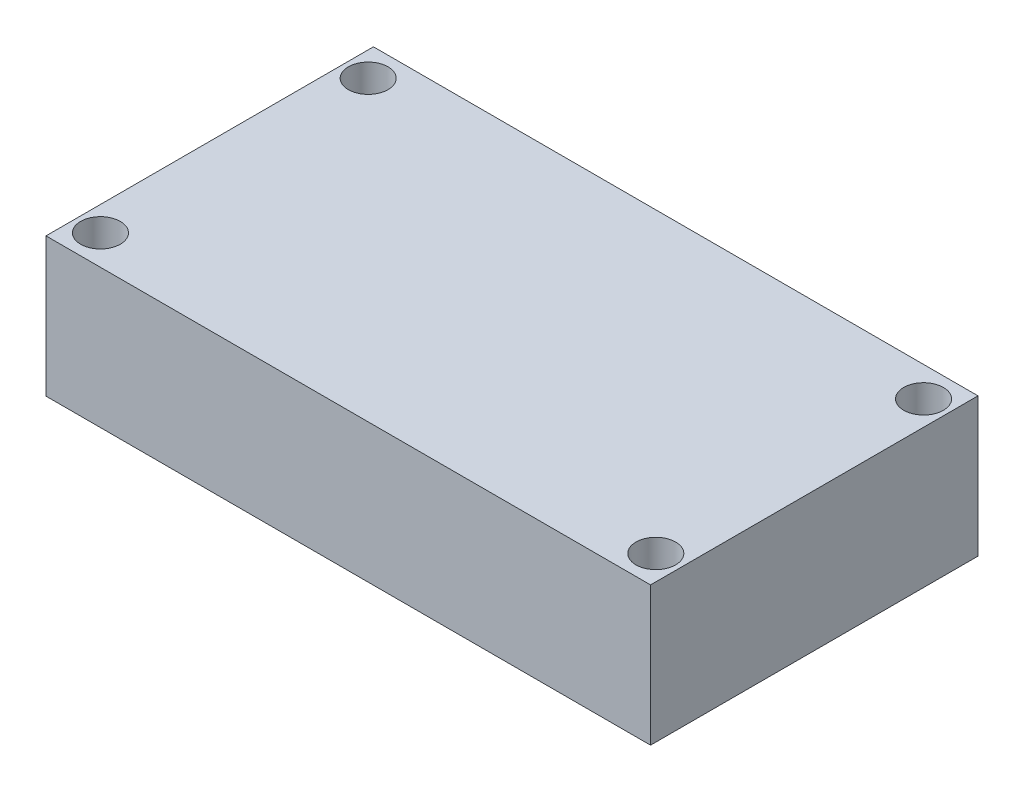
ISO-10303-21;
HEADER;
FILE_DESCRIPTION(('STEP AP214'),'2;1');
FILE_NAME('part.step','',(''),(''),'','','');
FILE_SCHEMA(('AUTOMOTIVE_DESIGN { 1 0 10303 214 1 1 1 1 }'));
ENDSEC;
DATA;
#1=APPLICATION_CONTEXT('core data for automotive mechanical design processes');
#2=APPLICATION_PROTOCOL_DEFINITION('international standard','automotive_design',2000,#1);
#3=PRODUCT_CONTEXT('',#1,'mechanical');
#4=PRODUCT('Part','Part','',(#3));
#5=PRODUCT_RELATED_PRODUCT_CATEGORY('part','',(#4));
#6=PRODUCT_DEFINITION_FORMATION('','',#4);
#7=PRODUCT_DEFINITION_CONTEXT('part definition',#1,'design');
#8=PRODUCT_DEFINITION('design','',#6,#7);
#9=PRODUCT_DEFINITION_SHAPE('','',#8);
#10=(LENGTH_UNIT() NAMED_UNIT(*) SI_UNIT(.MILLI.,.METRE.));
#11=(NAMED_UNIT(*) PLANE_ANGLE_UNIT() SI_UNIT($,.RADIAN.));
#12=(NAMED_UNIT(*) SI_UNIT($,.STERADIAN.) SOLID_ANGLE_UNIT());
#13=UNCERTAINTY_MEASURE_WITH_UNIT(LENGTH_MEASURE(1.E-05),#10,'distance_accuracy_value','');
#14=(GEOMETRIC_REPRESENTATION_CONTEXT(3) GLOBAL_UNCERTAINTY_ASSIGNED_CONTEXT((#13)) GLOBAL_UNIT_ASSIGNED_CONTEXT((#10,
#11,#12)) REPRESENTATION_CONTEXT('',''));
#15=CARTESIAN_POINT('',(0.,0.,0.));
#16=DIRECTION('',(0.,0.,1.));
#17=DIRECTION('',(1.,0.,0.));
#18=AXIS2_PLACEMENT_3D('',#15,#16,#17);
#19=CARTESIAN_POINT('',(30.48,14.,16.51));
#20=DIRECTION('',(-1.,0.,0.));
#21=DIRECTION('',(0.,0.,1.));
#22=AXIS2_PLACEMENT_3D('',#19,#20,#21);
#23=PLANE('',#22);
#24=DIRECTION('',(0.,0.,-1.));
#25=VECTOR('',#24,1.);
#26=CARTESIAN_POINT('',(30.48,0.,16.51));
#27=LINE('',#26,#25);
#28=CARTESIAN_POINT('',(30.48,0.,16.51));
#29=VERTEX_POINT('',#28);
#30=CARTESIAN_POINT('',(30.48,0.,-16.51));
#31=VERTEX_POINT('',#30);
#32=EDGE_CURVE('E96',#29,#31,#27,.T.);
#33=ORIENTED_EDGE('',*,*,#32,.T.);
#34=DIRECTION('',(0.,-1.,0.));
#35=VECTOR('',#34,1.);
#36=CARTESIAN_POINT('',(30.48,14.,-16.51));
#37=LINE('',#36,#35);
#38=CARTESIAN_POINT('',(30.48,14.,-16.51));
#39=VERTEX_POINT('',#38);
#40=EDGE_CURVE('E11',#39,#31,#37,.T.);
#41=ORIENTED_EDGE('',*,*,#40,.F.);
#42=DIRECTION('',(0.,0.,-1.));
#43=VECTOR('',#42,1.);
#44=CARTESIAN_POINT('',(30.48,14.,16.51));
#45=LINE('',#44,#43);
#46=CARTESIAN_POINT('',(30.48,14.,16.51));
#47=VERTEX_POINT('',#46);
#48=EDGE_CURVE('E84',#47,#39,#45,.T.);
#49=ORIENTED_EDGE('',*,*,#48,.F.);
#50=DIRECTION('',(0.,-1.,0.));
#51=VECTOR('',#50,1.);
#52=CARTESIAN_POINT('',(30.48,14.,16.51));
#53=LINE('',#52,#51);
#54=EDGE_CURVE('E92',#47,#29,#53,.T.);
#55=ORIENTED_EDGE('',*,*,#54,.T.);
#56=EDGE_LOOP('',(#33,#41,#49,#55));
#57=FACE_BOUND('',#56,.T.);
#58=ADVANCED_FACE('F33',(#57),#23,.F.);
#59=CARTESIAN_POINT('',(-30.48,14.,-16.51));
#60=DIRECTION('',(0.,0.,1.));
#61=DIRECTION('',(1.,0.,0.));
#62=AXIS2_PLACEMENT_3D('',#59,#60,#61);
#63=PLANE('',#62);
#64=DIRECTION('',(-1.,0.,0.));
#65=VECTOR('',#64,1.);
#66=CARTESIAN_POINT('',(-30.48,0.,-16.51));
#67=LINE('',#66,#65);
#68=CARTESIAN_POINT('',(-30.48,0.,-16.51));
#69=VERTEX_POINT('',#68);
#70=EDGE_CURVE('E88',#31,#69,#67,.T.);
#71=ORIENTED_EDGE('',*,*,#70,.T.);
#72=DIRECTION('',(0.,-1.,0.));
#73=VECTOR('',#72,1.);
#74=CARTESIAN_POINT('',(-30.48,14.,-16.51));
#75=LINE('',#74,#73);
#76=CARTESIAN_POINT('',(-30.48,14.,-16.51));
#77=VERTEX_POINT('',#76);
#78=EDGE_CURVE('E41',#77,#69,#75,.T.);
#79=ORIENTED_EDGE('',*,*,#78,.F.);
#80=DIRECTION('',(-1.,0.,0.));
#81=VECTOR('',#80,1.);
#82=CARTESIAN_POINT('',(-30.48,14.,-16.51));
#83=LINE('',#82,#81);
#84=EDGE_CURVE('E79',#39,#77,#83,.T.);
#85=ORIENTED_EDGE('',*,*,#84,.F.);
#86=ORIENTED_EDGE('',*,*,#40,.T.);
#87=EDGE_LOOP('',(#71,#79,#85,#86));
#88=FACE_BOUND('',#87,.T.);
#89=ADVANCED_FACE('F87',(#88),#63,.F.);
#90=CARTESIAN_POINT('',(-30.48,14.,16.51));
#91=DIRECTION('',(1.,0.,0.));
#92=DIRECTION('',(0.,0.,-1.));
#93=AXIS2_PLACEMENT_3D('',#90,#91,#92);
#94=PLANE('',#93);
#95=DIRECTION('',(0.,0.,1.));
#96=VECTOR('',#95,1.);
#97=CARTESIAN_POINT('',(-30.48,0.,16.51));
#98=LINE('',#97,#96);
#99=CARTESIAN_POINT('',(-30.48,0.,16.51));
#100=VERTEX_POINT('',#99);
#101=EDGE_CURVE('E66',#69,#100,#98,.T.);
#102=ORIENTED_EDGE('',*,*,#101,.T.);
#103=DIRECTION('',(0.,-1.,0.));
#104=VECTOR('',#103,1.);
#105=CARTESIAN_POINT('',(-30.48,14.,16.51));
#106=LINE('',#105,#104);
#107=CARTESIAN_POINT('',(-30.48,14.,16.51));
#108=VERTEX_POINT('',#107);
#109=EDGE_CURVE('E89',#108,#100,#106,.T.);
#110=ORIENTED_EDGE('',*,*,#109,.F.);
#111=DIRECTION('',(0.,0.,1.));
#112=VECTOR('',#111,1.);
#113=CARTESIAN_POINT('',(-30.48,14.,16.51));
#114=LINE('',#113,#112);
#115=EDGE_CURVE('E82',#77,#108,#114,.T.);
#116=ORIENTED_EDGE('',*,*,#115,.F.);
#117=ORIENTED_EDGE('',*,*,#78,.T.);
#118=EDGE_LOOP('',(#102,#110,#116,#117));
#119=FACE_BOUND('',#118,.T.);
#120=ADVANCED_FACE('F90',(#119),#94,.F.);
#121=CARTESIAN_POINT('',(-30.48,14.,16.51));
#122=DIRECTION('',(0.,0.,-1.));
#123=DIRECTION('',(-1.,0.,0.));
#124=AXIS2_PLACEMENT_3D('',#121,#122,#123);
#125=PLANE('',#124);
#126=DIRECTION('',(1.,0.,0.));
#127=VECTOR('',#126,1.);
#128=CARTESIAN_POINT('',(-30.48,0.,16.51));
#129=LINE('',#128,#127);
#130=EDGE_CURVE('E72',#100,#29,#129,.T.);
#131=ORIENTED_EDGE('',*,*,#130,.T.);
#132=ORIENTED_EDGE('',*,*,#54,.F.);
#133=DIRECTION('',(1.,0.,0.));
#134=VECTOR('',#133,1.);
#135=CARTESIAN_POINT('',(-30.48,14.,16.51));
#136=LINE('',#135,#134);
#137=EDGE_CURVE('E49',#108,#47,#136,.T.);
#138=ORIENTED_EDGE('',*,*,#137,.F.);
#139=ORIENTED_EDGE('',*,*,#109,.T.);
#140=EDGE_LOOP('',(#131,#132,#138,#139));
#141=FACE_BOUND('',#140,.T.);
#142=ADVANCED_FACE('F104',(#141),#125,.F.);
#143=CARTESIAN_POINT('',(0.,14.,0.));
#144=DIRECTION('',(0.,-1.,0.));
#145=DIRECTION('',(0.,0.,-1.));
#146=AXIS2_PLACEMENT_3D('',#143,#144,#145);
#147=PLANE('',#146);
#148=CARTESIAN_POINT('',(-28.,14.,13.5));
#149=DIRECTION('',(0.,1.,0.));
#150=DIRECTION('',(0.,0.,-1.));
#151=AXIS2_PLACEMENT_3D('',#148,#149,#150);
#152=CIRCLE('',#151,2.);
#153=CARTESIAN_POINT('',(-28.,14.,15.5));
#154=VERTEX_POINT('',#153);
#155=EDGE_CURVE('E119',#154,#154,#152,.T.);
#156=ORIENTED_EDGE('',*,*,#155,.F.);
#157=EDGE_LOOP('',(#156));
#158=FACE_BOUND('',#157,.T.);
#159=CARTESIAN_POINT('',(28.,14.,13.5));
#160=DIRECTION('',(0.,1.,0.));
#161=DIRECTION('',(0.,0.,-1.));
#162=AXIS2_PLACEMENT_3D('',#159,#160,#161);
#163=CIRCLE('',#162,2.);
#164=CARTESIAN_POINT('',(28.,14.,15.5));
#165=VERTEX_POINT('',#164);
#166=EDGE_CURVE('E125',#165,#165,#163,.T.);
#167=ORIENTED_EDGE('',*,*,#166,.F.);
#168=EDGE_LOOP('',(#167));
#169=FACE_BOUND('',#168,.T.);
#170=CARTESIAN_POINT('',(28.,14.,-13.5));
#171=DIRECTION('',(0.,1.,0.));
#172=DIRECTION('',(0.,0.,1.));
#173=AXIS2_PLACEMENT_3D('',#170,#171,#172);
#174=CIRCLE('',#173,2.);
#175=CARTESIAN_POINT('',(28.,14.,-11.5));
#176=VERTEX_POINT('',#175);
#177=EDGE_CURVE('E113',#176,#176,#174,.T.);
#178=ORIENTED_EDGE('',*,*,#177,.F.);
#179=EDGE_LOOP('',(#178));
#180=FACE_BOUND('',#179,.T.);
#181=CARTESIAN_POINT('',(-28.,14.,-13.5));
#182=DIRECTION('',(0.,1.,0.));
#183=DIRECTION('',(0.,0.,1.));
#184=AXIS2_PLACEMENT_3D('',#181,#182,#183);
#185=CIRCLE('',#184,2.);
#186=CARTESIAN_POINT('',(-28.,14.,-11.5));
#187=VERTEX_POINT('',#186);
#188=EDGE_CURVE('E99',#187,#187,#185,.T.);
#189=ORIENTED_EDGE('',*,*,#188,.F.);
#190=EDGE_LOOP('',(#189));
#191=FACE_BOUND('',#190,.T.);
#192=ORIENTED_EDGE('',*,*,#48,.T.);
#193=ORIENTED_EDGE('',*,*,#84,.T.);
#194=ORIENTED_EDGE('',*,*,#115,.T.);
#195=ORIENTED_EDGE('',*,*,#137,.T.);
#196=EDGE_LOOP('',(#192,#193,#194,#195));
#197=FACE_BOUND('',#196,.T.);
#198=ADVANCED_FACE('F80',(#158,#169,#180,#191,#197),#147,.F.);
#199=CARTESIAN_POINT('',(0.,0.,0.));
#200=DIRECTION('',(0.,-1.,0.));
#201=DIRECTION('',(0.,0.,-1.));
#202=AXIS2_PLACEMENT_3D('',#199,#200,#201);
#203=PLANE('',#202);
#204=CARTESIAN_POINT('',(-28.,0.,13.5));
#205=DIRECTION('',(0.,-1.,0.));
#206=DIRECTION('',(0.,0.,-1.));
#207=AXIS2_PLACEMENT_3D('',#204,#205,#206);
#208=CIRCLE('',#207,2.);
#209=CARTESIAN_POINT('',(-28.,0.,15.5));
#210=VERTEX_POINT('',#209);
#211=EDGE_CURVE('E116',#210,#210,#208,.F.);
#212=ORIENTED_EDGE('',*,*,#211,.T.);
#213=EDGE_LOOP('',(#212));
#214=FACE_BOUND('',#213,.T.);
#215=CARTESIAN_POINT('',(28.,0.,13.5));
#216=DIRECTION('',(0.,-1.,0.));
#217=DIRECTION('',(0.,0.,-1.));
#218=AXIS2_PLACEMENT_3D('',#215,#216,#217);
#219=CIRCLE('',#218,2.);
#220=CARTESIAN_POINT('',(28.,0.,15.5));
#221=VERTEX_POINT('',#220);
#222=EDGE_CURVE('E122',#221,#221,#219,.F.);
#223=ORIENTED_EDGE('',*,*,#222,.T.);
#224=EDGE_LOOP('',(#223));
#225=FACE_BOUND('',#224,.T.);
#226=CARTESIAN_POINT('',(28.,0.,-13.5));
#227=DIRECTION('',(0.,-1.,0.));
#228=DIRECTION('',(0.,0.,-1.));
#229=AXIS2_PLACEMENT_3D('',#226,#227,#228);
#230=CIRCLE('',#229,2.);
#231=CARTESIAN_POINT('',(28.,0.,-11.5));
#232=VERTEX_POINT('',#231);
#233=EDGE_CURVE('E128',#232,#232,#230,.F.);
#234=ORIENTED_EDGE('',*,*,#233,.T.);
#235=EDGE_LOOP('',(#234));
#236=FACE_BOUND('',#235,.T.);
#237=CARTESIAN_POINT('',(-28.,0.,-13.5));
#238=DIRECTION('',(0.,-1.,0.));
#239=DIRECTION('',(0.,0.,-1.));
#240=AXIS2_PLACEMENT_3D('',#237,#238,#239);
#241=CIRCLE('',#240,2.);
#242=CARTESIAN_POINT('',(-28.,0.,-11.5));
#243=VERTEX_POINT('',#242);
#244=EDGE_CURVE('E110',#243,#243,#241,.F.);
#245=ORIENTED_EDGE('',*,*,#244,.T.);
#246=EDGE_LOOP('',(#245));
#247=FACE_BOUND('',#246,.T.);
#248=ORIENTED_EDGE('',*,*,#32,.F.);
#249=ORIENTED_EDGE('',*,*,#130,.F.);
#250=ORIENTED_EDGE('',*,*,#101,.F.);
#251=ORIENTED_EDGE('',*,*,#70,.F.);
#252=EDGE_LOOP('',(#248,#249,#250,#251));
#253=FACE_BOUND('',#252,.T.);
#254=ADVANCED_FACE('F107',(#214,#225,#236,#247,#253),#203,.T.);
#255=CARTESIAN_POINT('',(-28.,-0.000999999999999265,-13.5));
#256=DIRECTION('',(0.,1.,0.));
#257=DIRECTION('',(0.,0.,1.));
#258=AXIS2_PLACEMENT_3D('',#255,#256,#257);
#259=CYLINDRICAL_SURFACE('',#258,2.);
#260=CARTESIAN_POINT('',(-28.,0.,-11.5));
#261=CARTESIAN_POINT('',(-28.,0.145833333333333,-11.5));
#262=CARTESIAN_POINT('',(-28.,0.291666666666667,-11.5));
#263=CARTESIAN_POINT('',(-28.,0.583333333333333,-11.5));
#264=CARTESIAN_POINT('',(-28.,0.729166666666667,-11.5));
#265=CARTESIAN_POINT('',(-28.,1.02083333333333,-11.5));
#266=CARTESIAN_POINT('',(-28.,1.16666666666667,-11.5));
#267=CARTESIAN_POINT('',(-28.,1.45833333333333,-11.5));
#268=CARTESIAN_POINT('',(-28.,1.60416666666667,-11.5));
#269=CARTESIAN_POINT('',(-28.,1.89583333333333,-11.5));
#270=CARTESIAN_POINT('',(-28.,2.04166666666667,-11.5));
#271=CARTESIAN_POINT('',(-28.,2.33333333333333,-11.5));
#272=CARTESIAN_POINT('',(-28.,2.47916666666667,-11.5));
#273=CARTESIAN_POINT('',(-28.,2.77083333333333,-11.5));
#274=CARTESIAN_POINT('',(-28.,2.91666666666667,-11.5));
#275=CARTESIAN_POINT('',(-28.,3.20833333333333,-11.5));
#276=CARTESIAN_POINT('',(-28.,3.35416666666667,-11.5));
#277=CARTESIAN_POINT('',(-28.,3.64583333333333,-11.5));
#278=CARTESIAN_POINT('',(-28.,3.79166666666667,-11.5));
#279=CARTESIAN_POINT('',(-28.,4.08333333333333,-11.5));
#280=CARTESIAN_POINT('',(-28.,4.22916666666667,-11.5));
#281=CARTESIAN_POINT('',(-28.,4.52083333333333,-11.5));
#282=CARTESIAN_POINT('',(-28.,4.66666666666667,-11.5));
#283=CARTESIAN_POINT('',(-28.,4.95833333333333,-11.5));
#284=CARTESIAN_POINT('',(-28.,5.10416666666667,-11.5));
#285=CARTESIAN_POINT('',(-28.,5.39583333333333,-11.5));
#286=CARTESIAN_POINT('',(-28.,5.54166666666667,-11.5));
#287=CARTESIAN_POINT('',(-28.,5.83333333333333,-11.5));
#288=CARTESIAN_POINT('',(-28.,5.97916666666667,-11.5));
#289=CARTESIAN_POINT('',(-28.,6.27083333333333,-11.5));
#290=CARTESIAN_POINT('',(-28.,6.41666666666667,-11.5));
#291=CARTESIAN_POINT('',(-28.,6.70833333333333,-11.5));
#292=CARTESIAN_POINT('',(-28.,6.85416666666667,-11.5));
#293=CARTESIAN_POINT('',(-28.,7.14583333333333,-11.5));
#294=CARTESIAN_POINT('',(-28.,7.29166666666667,-11.5));
#295=CARTESIAN_POINT('',(-28.,7.58333333333333,-11.5));
#296=CARTESIAN_POINT('',(-28.,7.72916666666667,-11.5));
#297=CARTESIAN_POINT('',(-28.,8.02083333333333,-11.5));
#298=CARTESIAN_POINT('',(-28.,8.16666666666667,-11.5));
#299=CARTESIAN_POINT('',(-28.,8.45833333333333,-11.5));
#300=CARTESIAN_POINT('',(-28.,8.60416666666667,-11.5));
#301=CARTESIAN_POINT('',(-28.,8.89583333333333,-11.5));
#302=CARTESIAN_POINT('',(-28.,9.04166666666666,-11.5));
#303=CARTESIAN_POINT('',(-28.,9.33333333333333,-11.5));
#304=CARTESIAN_POINT('',(-28.,9.47916666666667,-11.5));
#305=CARTESIAN_POINT('',(-28.,9.77083333333333,-11.5));
#306=CARTESIAN_POINT('',(-28.,9.91666666666667,-11.5));
#307=CARTESIAN_POINT('',(-28.,10.2083333333333,-11.5));
#308=CARTESIAN_POINT('',(-28.,10.3541666666667,-11.5));
#309=CARTESIAN_POINT('',(-28.,10.6458333333333,-11.5));
#310=CARTESIAN_POINT('',(-28.,10.7916666666667,-11.5));
#311=CARTESIAN_POINT('',(-28.,11.0833333333333,-11.5));
#312=CARTESIAN_POINT('',(-28.,11.2291666666667,-11.5));
#313=CARTESIAN_POINT('',(-28.,11.5208333333333,-11.5));
#314=CARTESIAN_POINT('',(-28.,11.6666666666667,-11.5));
#315=CARTESIAN_POINT('',(-28.,11.9583333333333,-11.5));
#316=CARTESIAN_POINT('',(-28.,12.1041666666667,-11.5));
#317=CARTESIAN_POINT('',(-28.,12.3958333333333,-11.5));
#318=CARTESIAN_POINT('',(-28.,12.5416666666667,-11.5));
#319=CARTESIAN_POINT('',(-28.,12.8333333333333,-11.5));
#320=CARTESIAN_POINT('',(-28.,12.9791666666667,-11.5));
#321=CARTESIAN_POINT('',(-28.,13.2708333333333,-11.5));
#322=CARTESIAN_POINT('',(-28.,13.4166666666667,-11.5));
#323=CARTESIAN_POINT('',(-28.,13.7083333333333,-11.5));
#324=CARTESIAN_POINT('',(-28.,13.8541666666667,-11.5));
#325=CARTESIAN_POINT('',(-28.,14.,-11.5));
#326=B_SPLINE_CURVE_WITH_KNOTS('',3,(#260,#261,#262,#263,#264,#265,#266,#267,#268,#269,#270,
#271,#272,#273,#274,#275,#276,#277,#278,#279,#280,#281,#282,#283,#284,#285,#286,#287,#288,#289,
#290,#291,#292,#293,#294,#295,#296,#297,#298,#299,#300,#301,#302,#303,#304,#305,#306,#307,#308,
#309,#310,#311,#312,#313,#314,#315,#316,#317,#318,#319,#320,#321,#322,#323,#324,#325),
.UNSPECIFIED.,.F.,.F.,(4,2,2,2,2,2,2,2,2,2,2,2,2,2,2,2,2,2,2,2,2,2,2,2,2,2,2,2,2,2,2,2,4),(0.,
0.4375,0.875,1.3125,1.75,2.1875,2.625,3.0625,3.5,3.9375,4.375,4.8125,5.25,5.6875,6.125,6.5625,
7.,7.4375,7.875,8.3125,8.75,9.1875,9.625,10.0625,10.5,10.9375,11.375,11.8125,12.25,12.6875,
13.125,13.5625,14.),.UNSPECIFIED.);
#327=EDGE_CURVE('BSEAM142',#243,#187,#326,.T.);
#328=ORIENTED_EDGE('',*,*,#244,.F.);
#329=ORIENTED_EDGE('',*,*,#188,.T.);
#330=ORIENTED_EDGE('',*,*,#327,.T.);
#331=ORIENTED_EDGE('',*,*,#327,.F.);
#332=EDGE_LOOP('',(#328,#330,#329,#331));
#333=FACE_BOUND('',#332,.T.);
#334=ADVANCED_FACE('F142',(#333),#259,.F.);
#335=CARTESIAN_POINT('',(28.,-0.000999999999999265,-13.5));
#336=DIRECTION('',(0.,1.,0.));
#337=DIRECTION('',(0.,0.,1.));
#338=AXIS2_PLACEMENT_3D('',#335,#336,#337);
#339=CYLINDRICAL_SURFACE('',#338,2.);
#340=CARTESIAN_POINT('',(28.,0.,-11.5));
#341=CARTESIAN_POINT('',(28.,0.145833333333333,-11.5));
#342=CARTESIAN_POINT('',(28.,0.291666666666667,-11.5));
#343=CARTESIAN_POINT('',(28.,0.583333333333333,-11.5));
#344=CARTESIAN_POINT('',(28.,0.729166666666667,-11.5));
#345=CARTESIAN_POINT('',(28.,1.02083333333333,-11.5));
#346=CARTESIAN_POINT('',(28.,1.16666666666667,-11.5));
#347=CARTESIAN_POINT('',(28.,1.45833333333333,-11.5));
#348=CARTESIAN_POINT('',(28.,1.60416666666667,-11.5));
#349=CARTESIAN_POINT('',(28.,1.89583333333333,-11.5));
#350=CARTESIAN_POINT('',(28.,2.04166666666667,-11.5));
#351=CARTESIAN_POINT('',(28.,2.33333333333333,-11.5));
#352=CARTESIAN_POINT('',(28.,2.47916666666667,-11.5));
#353=CARTESIAN_POINT('',(28.,2.77083333333333,-11.5));
#354=CARTESIAN_POINT('',(28.,2.91666666666667,-11.5));
#355=CARTESIAN_POINT('',(28.,3.20833333333333,-11.5));
#356=CARTESIAN_POINT('',(28.,3.35416666666667,-11.5));
#357=CARTESIAN_POINT('',(28.,3.64583333333333,-11.5));
#358=CARTESIAN_POINT('',(28.,3.79166666666667,-11.5));
#359=CARTESIAN_POINT('',(28.,4.08333333333333,-11.5));
#360=CARTESIAN_POINT('',(28.,4.22916666666667,-11.5));
#361=CARTESIAN_POINT('',(28.,4.52083333333333,-11.5));
#362=CARTESIAN_POINT('',(28.,4.66666666666667,-11.5));
#363=CARTESIAN_POINT('',(28.,4.95833333333333,-11.5));
#364=CARTESIAN_POINT('',(28.,5.10416666666667,-11.5));
#365=CARTESIAN_POINT('',(28.,5.39583333333333,-11.5));
#366=CARTESIAN_POINT('',(28.,5.54166666666667,-11.5));
#367=CARTESIAN_POINT('',(28.,5.83333333333333,-11.5));
#368=CARTESIAN_POINT('',(28.,5.97916666666667,-11.5));
#369=CARTESIAN_POINT('',(28.,6.27083333333333,-11.5));
#370=CARTESIAN_POINT('',(28.,6.41666666666667,-11.5));
#371=CARTESIAN_POINT('',(28.,6.70833333333333,-11.5));
#372=CARTESIAN_POINT('',(28.,6.85416666666667,-11.5));
#373=CARTESIAN_POINT('',(28.,7.14583333333333,-11.5));
#374=CARTESIAN_POINT('',(28.,7.29166666666667,-11.5));
#375=CARTESIAN_POINT('',(28.,7.58333333333333,-11.5));
#376=CARTESIAN_POINT('',(28.,7.72916666666667,-11.5));
#377=CARTESIAN_POINT('',(28.,8.02083333333333,-11.5));
#378=CARTESIAN_POINT('',(28.,8.16666666666667,-11.5));
#379=CARTESIAN_POINT('',(28.,8.45833333333333,-11.5));
#380=CARTESIAN_POINT('',(28.,8.60416666666667,-11.5));
#381=CARTESIAN_POINT('',(28.,8.89583333333333,-11.5));
#382=CARTESIAN_POINT('',(28.,9.04166666666666,-11.5));
#383=CARTESIAN_POINT('',(28.,9.33333333333333,-11.5));
#384=CARTESIAN_POINT('',(28.,9.47916666666667,-11.5));
#385=CARTESIAN_POINT('',(28.,9.77083333333333,-11.5));
#386=CARTESIAN_POINT('',(28.,9.91666666666667,-11.5));
#387=CARTESIAN_POINT('',(28.,10.2083333333333,-11.5));
#388=CARTESIAN_POINT('',(28.,10.3541666666667,-11.5));
#389=CARTESIAN_POINT('',(28.,10.6458333333333,-11.5));
#390=CARTESIAN_POINT('',(28.,10.7916666666667,-11.5));
#391=CARTESIAN_POINT('',(28.,11.0833333333333,-11.5));
#392=CARTESIAN_POINT('',(28.,11.2291666666667,-11.5));
#393=CARTESIAN_POINT('',(28.,11.5208333333333,-11.5));
#394=CARTESIAN_POINT('',(28.,11.6666666666667,-11.5));
#395=CARTESIAN_POINT('',(28.,11.9583333333333,-11.5));
#396=CARTESIAN_POINT('',(28.,12.1041666666667,-11.5));
#397=CARTESIAN_POINT('',(28.,12.3958333333333,-11.5));
#398=CARTESIAN_POINT('',(28.,12.5416666666667,-11.5));
#399=CARTESIAN_POINT('',(28.,12.8333333333333,-11.5));
#400=CARTESIAN_POINT('',(28.,12.9791666666667,-11.5));
#401=CARTESIAN_POINT('',(28.,13.2708333333333,-11.5));
#402=CARTESIAN_POINT('',(28.,13.4166666666667,-11.5));
#403=CARTESIAN_POINT('',(28.,13.7083333333333,-11.5));
#404=CARTESIAN_POINT('',(28.,13.8541666666667,-11.5));
#405=CARTESIAN_POINT('',(28.,14.,-11.5));
#406=B_SPLINE_CURVE_WITH_KNOTS('',3,(#340,#341,#342,#343,#344,#345,#346,#347,#348,#349,#350,
#351,#352,#353,#354,#355,#356,#357,#358,#359,#360,#361,#362,#363,#364,#365,#366,#367,#368,#369,
#370,#371,#372,#373,#374,#375,#376,#377,#378,#379,#380,#381,#382,#383,#384,#385,#386,#387,#388,
#389,#390,#391,#392,#393,#394,#395,#396,#397,#398,#399,#400,#401,#402,#403,#404,#405),
.UNSPECIFIED.,.F.,.F.,(4,2,2,2,2,2,2,2,2,2,2,2,2,2,2,2,2,2,2,2,2,2,2,2,2,2,2,2,2,2,2,2,4),(0.,
0.4375,0.875,1.3125,1.75,2.1875,2.625,3.0625,3.5,3.9375,4.375,4.8125,5.25,5.6875,6.125,6.5625,
7.,7.4375,7.875,8.3125,8.75,9.1875,9.625,10.0625,10.5,10.9375,11.375,11.8125,12.25,12.6875,
13.125,13.5625,14.),.UNSPECIFIED.);
#407=EDGE_CURVE('BSEAM134',#232,#176,#406,.T.);
#408=ORIENTED_EDGE('',*,*,#233,.F.);
#409=ORIENTED_EDGE('',*,*,#177,.T.);
#410=ORIENTED_EDGE('',*,*,#407,.T.);
#411=ORIENTED_EDGE('',*,*,#407,.F.);
#412=EDGE_LOOP('',(#408,#410,#409,#411));
#413=FACE_BOUND('',#412,.T.);
#414=ADVANCED_FACE('F134',(#413),#339,.F.);
#415=CARTESIAN_POINT('',(28.,-0.000999999999999265,13.5));
#416=DIRECTION('',(0.,1.,0.));
#417=DIRECTION('',(0.,0.,1.));
#418=AXIS2_PLACEMENT_3D('',#415,#416,#417);
#419=CYLINDRICAL_SURFACE('',#418,2.);
#420=CARTESIAN_POINT('',(28.,0.,15.5));
#421=CARTESIAN_POINT('',(28.,0.145833333333333,15.5));
#422=CARTESIAN_POINT('',(28.,0.291666666666667,15.5));
#423=CARTESIAN_POINT('',(28.,0.583333333333333,15.5));
#424=CARTESIAN_POINT('',(28.,0.729166666666667,15.5));
#425=CARTESIAN_POINT('',(28.,1.02083333333333,15.5));
#426=CARTESIAN_POINT('',(28.,1.16666666666667,15.5));
#427=CARTESIAN_POINT('',(28.,1.45833333333333,15.5));
#428=CARTESIAN_POINT('',(28.,1.60416666666667,15.5));
#429=CARTESIAN_POINT('',(28.,1.89583333333333,15.5));
#430=CARTESIAN_POINT('',(28.,2.04166666666667,15.5));
#431=CARTESIAN_POINT('',(28.,2.33333333333333,15.5));
#432=CARTESIAN_POINT('',(28.,2.47916666666667,15.5));
#433=CARTESIAN_POINT('',(28.,2.77083333333333,15.5));
#434=CARTESIAN_POINT('',(28.,2.91666666666667,15.5));
#435=CARTESIAN_POINT('',(28.,3.20833333333333,15.5));
#436=CARTESIAN_POINT('',(28.,3.35416666666667,15.5));
#437=CARTESIAN_POINT('',(28.,3.64583333333333,15.5));
#438=CARTESIAN_POINT('',(28.,3.79166666666667,15.5));
#439=CARTESIAN_POINT('',(28.,4.08333333333333,15.5));
#440=CARTESIAN_POINT('',(28.,4.22916666666667,15.5));
#441=CARTESIAN_POINT('',(28.,4.52083333333333,15.5));
#442=CARTESIAN_POINT('',(28.,4.66666666666667,15.5));
#443=CARTESIAN_POINT('',(28.,4.95833333333333,15.5));
#444=CARTESIAN_POINT('',(28.,5.10416666666667,15.5));
#445=CARTESIAN_POINT('',(28.,5.39583333333333,15.5));
#446=CARTESIAN_POINT('',(28.,5.54166666666667,15.5));
#447=CARTESIAN_POINT('',(28.,5.83333333333333,15.5));
#448=CARTESIAN_POINT('',(28.,5.97916666666667,15.5));
#449=CARTESIAN_POINT('',(28.,6.27083333333333,15.5));
#450=CARTESIAN_POINT('',(28.,6.41666666666667,15.5));
#451=CARTESIAN_POINT('',(28.,6.70833333333333,15.5));
#452=CARTESIAN_POINT('',(28.,6.85416666666667,15.5));
#453=CARTESIAN_POINT('',(28.,7.14583333333333,15.5));
#454=CARTESIAN_POINT('',(28.,7.29166666666667,15.5));
#455=CARTESIAN_POINT('',(28.,7.58333333333333,15.5));
#456=CARTESIAN_POINT('',(28.,7.72916666666667,15.5));
#457=CARTESIAN_POINT('',(28.,8.02083333333333,15.5));
#458=CARTESIAN_POINT('',(28.,8.16666666666667,15.5));
#459=CARTESIAN_POINT('',(28.,8.45833333333333,15.5));
#460=CARTESIAN_POINT('',(28.,8.60416666666667,15.5));
#461=CARTESIAN_POINT('',(28.,8.89583333333333,15.5));
#462=CARTESIAN_POINT('',(28.,9.04166666666666,15.5));
#463=CARTESIAN_POINT('',(28.,9.33333333333333,15.5));
#464=CARTESIAN_POINT('',(28.,9.47916666666667,15.5));
#465=CARTESIAN_POINT('',(28.,9.77083333333333,15.5));
#466=CARTESIAN_POINT('',(28.,9.91666666666667,15.5));
#467=CARTESIAN_POINT('',(28.,10.2083333333333,15.5));
#468=CARTESIAN_POINT('',(28.,10.3541666666667,15.5));
#469=CARTESIAN_POINT('',(28.,10.6458333333333,15.5));
#470=CARTESIAN_POINT('',(28.,10.7916666666667,15.5));
#471=CARTESIAN_POINT('',(28.,11.0833333333333,15.5));
#472=CARTESIAN_POINT('',(28.,11.2291666666667,15.5));
#473=CARTESIAN_POINT('',(28.,11.5208333333333,15.5));
#474=CARTESIAN_POINT('',(28.,11.6666666666667,15.5));
#475=CARTESIAN_POINT('',(28.,11.9583333333333,15.5));
#476=CARTESIAN_POINT('',(28.,12.1041666666667,15.5));
#477=CARTESIAN_POINT('',(28.,12.3958333333333,15.5));
#478=CARTESIAN_POINT('',(28.,12.5416666666667,15.5));
#479=CARTESIAN_POINT('',(28.,12.8333333333333,15.5));
#480=CARTESIAN_POINT('',(28.,12.9791666666667,15.5));
#481=CARTESIAN_POINT('',(28.,13.2708333333333,15.5));
#482=CARTESIAN_POINT('',(28.,13.4166666666667,15.5));
#483=CARTESIAN_POINT('',(28.,13.7083333333333,15.5));
#484=CARTESIAN_POINT('',(28.,13.8541666666667,15.5));
#485=CARTESIAN_POINT('',(28.,14.,15.5));
#486=B_SPLINE_CURVE_WITH_KNOTS('',3,(#420,#421,#422,#423,#424,#425,#426,#427,#428,#429,#430,
#431,#432,#433,#434,#435,#436,#437,#438,#439,#440,#441,#442,#443,#444,#445,#446,#447,#448,#449,
#450,#451,#452,#453,#454,#455,#456,#457,#458,#459,#460,#461,#462,#463,#464,#465,#466,#467,#468,
#469,#470,#471,#472,#473,#474,#475,#476,#477,#478,#479,#480,#481,#482,#483,#484,#485),
.UNSPECIFIED.,.F.,.F.,(4,2,2,2,2,2,2,2,2,2,2,2,2,2,2,2,2,2,2,2,2,2,2,2,2,2,2,2,2,2,2,2,4),(0.,
0.4375,0.875,1.3125,1.75,2.1875,2.625,3.0625,3.5,3.9375,4.375,4.8125,5.25,5.6875,6.125,6.5625,
7.,7.4375,7.875,8.3125,8.75,9.1875,9.625,10.0625,10.5,10.9375,11.375,11.8125,12.25,12.6875,
13.125,13.5625,14.),.UNSPECIFIED.);
#487=EDGE_CURVE('BSEAM150',#221,#165,#486,.T.);
#488=ORIENTED_EDGE('',*,*,#222,.F.);
#489=ORIENTED_EDGE('',*,*,#166,.T.);
#490=ORIENTED_EDGE('',*,*,#487,.T.);
#491=ORIENTED_EDGE('',*,*,#487,.F.);
#492=EDGE_LOOP('',(#488,#490,#489,#491));
#493=FACE_BOUND('',#492,.T.);
#494=ADVANCED_FACE('F150',(#493),#419,.F.);
#495=CARTESIAN_POINT('',(-28.,-0.000999999999999265,13.5));
#496=DIRECTION('',(0.,1.,0.));
#497=DIRECTION('',(0.,0.,1.));
#498=AXIS2_PLACEMENT_3D('',#495,#496,#497);
#499=CYLINDRICAL_SURFACE('',#498,2.);
#500=CARTESIAN_POINT('',(-28.,0.,15.5));
#501=CARTESIAN_POINT('',(-28.,0.145833333333333,15.5));
#502=CARTESIAN_POINT('',(-28.,0.291666666666667,15.5));
#503=CARTESIAN_POINT('',(-28.,0.583333333333333,15.5));
#504=CARTESIAN_POINT('',(-28.,0.729166666666667,15.5));
#505=CARTESIAN_POINT('',(-28.,1.02083333333333,15.5));
#506=CARTESIAN_POINT('',(-28.,1.16666666666667,15.5));
#507=CARTESIAN_POINT('',(-28.,1.45833333333333,15.5));
#508=CARTESIAN_POINT('',(-28.,1.60416666666667,15.5));
#509=CARTESIAN_POINT('',(-28.,1.89583333333333,15.5));
#510=CARTESIAN_POINT('',(-28.,2.04166666666667,15.5));
#511=CARTESIAN_POINT('',(-28.,2.33333333333333,15.5));
#512=CARTESIAN_POINT('',(-28.,2.47916666666667,15.5));
#513=CARTESIAN_POINT('',(-28.,2.77083333333333,15.5));
#514=CARTESIAN_POINT('',(-28.,2.91666666666667,15.5));
#515=CARTESIAN_POINT('',(-28.,3.20833333333333,15.5));
#516=CARTESIAN_POINT('',(-28.,3.35416666666667,15.5));
#517=CARTESIAN_POINT('',(-28.,3.64583333333333,15.5));
#518=CARTESIAN_POINT('',(-28.,3.79166666666667,15.5));
#519=CARTESIAN_POINT('',(-28.,4.08333333333333,15.5));
#520=CARTESIAN_POINT('',(-28.,4.22916666666667,15.5));
#521=CARTESIAN_POINT('',(-28.,4.52083333333333,15.5));
#522=CARTESIAN_POINT('',(-28.,4.66666666666667,15.5));
#523=CARTESIAN_POINT('',(-28.,4.95833333333333,15.5));
#524=CARTESIAN_POINT('',(-28.,5.10416666666667,15.5));
#525=CARTESIAN_POINT('',(-28.,5.39583333333333,15.5));
#526=CARTESIAN_POINT('',(-28.,5.54166666666667,15.5));
#527=CARTESIAN_POINT('',(-28.,5.83333333333333,15.5));
#528=CARTESIAN_POINT('',(-28.,5.97916666666667,15.5));
#529=CARTESIAN_POINT('',(-28.,6.27083333333333,15.5));
#530=CARTESIAN_POINT('',(-28.,6.41666666666667,15.5));
#531=CARTESIAN_POINT('',(-28.,6.70833333333333,15.5));
#532=CARTESIAN_POINT('',(-28.,6.85416666666667,15.5));
#533=CARTESIAN_POINT('',(-28.,7.14583333333333,15.5));
#534=CARTESIAN_POINT('',(-28.,7.29166666666667,15.5));
#535=CARTESIAN_POINT('',(-28.,7.58333333333333,15.5));
#536=CARTESIAN_POINT('',(-28.,7.72916666666667,15.5));
#537=CARTESIAN_POINT('',(-28.,8.02083333333333,15.5));
#538=CARTESIAN_POINT('',(-28.,8.16666666666667,15.5));
#539=CARTESIAN_POINT('',(-28.,8.45833333333333,15.5));
#540=CARTESIAN_POINT('',(-28.,8.60416666666667,15.5));
#541=CARTESIAN_POINT('',(-28.,8.89583333333333,15.5));
#542=CARTESIAN_POINT('',(-28.,9.04166666666666,15.5));
#543=CARTESIAN_POINT('',(-28.,9.33333333333333,15.5));
#544=CARTESIAN_POINT('',(-28.,9.47916666666667,15.5));
#545=CARTESIAN_POINT('',(-28.,9.77083333333333,15.5));
#546=CARTESIAN_POINT('',(-28.,9.91666666666667,15.5));
#547=CARTESIAN_POINT('',(-28.,10.2083333333333,15.5));
#548=CARTESIAN_POINT('',(-28.,10.3541666666667,15.5));
#549=CARTESIAN_POINT('',(-28.,10.6458333333333,15.5));
#550=CARTESIAN_POINT('',(-28.,10.7916666666667,15.5));
#551=CARTESIAN_POINT('',(-28.,11.0833333333333,15.5));
#552=CARTESIAN_POINT('',(-28.,11.2291666666667,15.5));
#553=CARTESIAN_POINT('',(-28.,11.5208333333333,15.5));
#554=CARTESIAN_POINT('',(-28.,11.6666666666667,15.5));
#555=CARTESIAN_POINT('',(-28.,11.9583333333333,15.5));
#556=CARTESIAN_POINT('',(-28.,12.1041666666667,15.5));
#557=CARTESIAN_POINT('',(-28.,12.3958333333333,15.5));
#558=CARTESIAN_POINT('',(-28.,12.5416666666667,15.5));
#559=CARTESIAN_POINT('',(-28.,12.8333333333333,15.5));
#560=CARTESIAN_POINT('',(-28.,12.9791666666667,15.5));
#561=CARTESIAN_POINT('',(-28.,13.2708333333333,15.5));
#562=CARTESIAN_POINT('',(-28.,13.4166666666667,15.5));
#563=CARTESIAN_POINT('',(-28.,13.7083333333333,15.5));
#564=CARTESIAN_POINT('',(-28.,13.8541666666667,15.5));
#565=CARTESIAN_POINT('',(-28.,14.,15.5));
#566=B_SPLINE_CURVE_WITH_KNOTS('',3,(#500,#501,#502,#503,#504,#505,#506,#507,#508,#509,#510,
#511,#512,#513,#514,#515,#516,#517,#518,#519,#520,#521,#522,#523,#524,#525,#526,#527,#528,#529,
#530,#531,#532,#533,#534,#535,#536,#537,#538,#539,#540,#541,#542,#543,#544,#545,#546,#547,#548,
#549,#550,#551,#552,#553,#554,#555,#556,#557,#558,#559,#560,#561,#562,#563,#564,#565),
.UNSPECIFIED.,.F.,.F.,(4,2,2,2,2,2,2,2,2,2,2,2,2,2,2,2,2,2,2,2,2,2,2,2,2,2,2,2,2,2,2,2,4),(0.,
0.4375,0.875,1.3125,1.75,2.1875,2.625,3.0625,3.5,3.9375,4.375,4.8125,5.25,5.6875,6.125,6.5625,
7.,7.4375,7.875,8.3125,8.75,9.1875,9.625,10.0625,10.5,10.9375,11.375,11.8125,12.25,12.6875,
13.125,13.5625,14.),.UNSPECIFIED.);
#567=EDGE_CURVE('BSEAM198',#210,#154,#566,.T.);
#568=ORIENTED_EDGE('',*,*,#211,.F.);
#569=ORIENTED_EDGE('',*,*,#155,.T.);
#570=ORIENTED_EDGE('',*,*,#567,.T.);
#571=ORIENTED_EDGE('',*,*,#567,.F.);
#572=EDGE_LOOP('',(#568,#570,#569,#571));
#573=FACE_BOUND('',#572,.T.);
#574=ADVANCED_FACE('F198',(#573),#499,.F.);
#575=CLOSED_SHELL('',(#58,#89,#120,#142,#198,#254,#334,#414,#494,#574));
#576=MANIFOLD_SOLID_BREP('B2',#575);
#577=ADVANCED_BREP_SHAPE_REPRESENTATION('',(#18,#576),#14);
#578=SHAPE_DEFINITION_REPRESENTATION(#9,#577);
ENDSEC;
END-ISO-10303-21;
